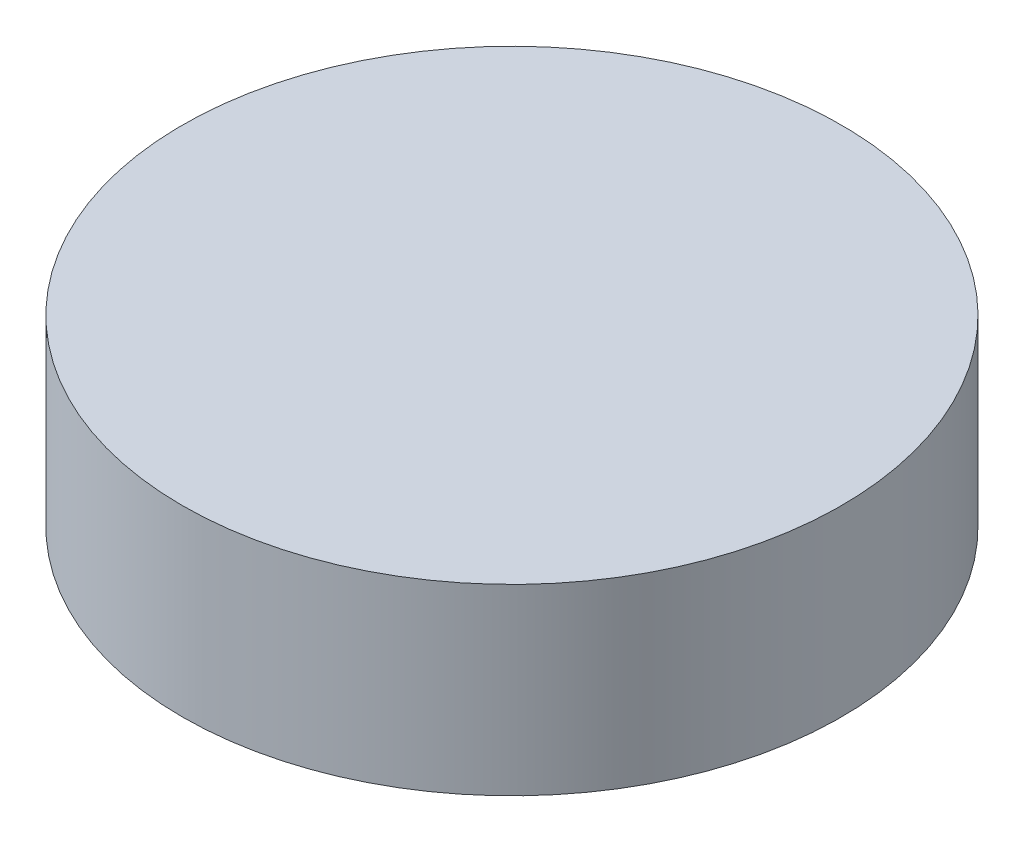
ISO-10303-21;
HEADER;
FILE_DESCRIPTION(('STEP AP214'),'2;1');
FILE_NAME('part.step','',(''),(''),'','','');
FILE_SCHEMA(('AUTOMOTIVE_DESIGN { 1 0 10303 214 1 1 1 1 }'));
ENDSEC;
DATA;
#1=APPLICATION_CONTEXT('core data for automotive mechanical design processes');
#2=APPLICATION_PROTOCOL_DEFINITION('international standard','automotive_design',2000,#1);
#3=PRODUCT_CONTEXT('',#1,'mechanical');
#4=PRODUCT('Part','Part','',(#3));
#5=PRODUCT_RELATED_PRODUCT_CATEGORY('part','',(#4));
#6=PRODUCT_DEFINITION_FORMATION('','',#4);
#7=PRODUCT_DEFINITION_CONTEXT('part definition',#1,'design');
#8=PRODUCT_DEFINITION('design','',#6,#7);
#9=PRODUCT_DEFINITION_SHAPE('','',#8);
#10=(LENGTH_UNIT() NAMED_UNIT(*) SI_UNIT(.MILLI.,.METRE.));
#11=(NAMED_UNIT(*) PLANE_ANGLE_UNIT() SI_UNIT($,.RADIAN.));
#12=(NAMED_UNIT(*) SI_UNIT($,.STERADIAN.) SOLID_ANGLE_UNIT());
#13=UNCERTAINTY_MEASURE_WITH_UNIT(LENGTH_MEASURE(1.E-05),#10,'distance_accuracy_value','');
#14=(GEOMETRIC_REPRESENTATION_CONTEXT(3) GLOBAL_UNCERTAINTY_ASSIGNED_CONTEXT((#13)) GLOBAL_UNIT_ASSIGNED_CONTEXT((#10,
#11,#12)) REPRESENTATION_CONTEXT('',''));
#15=CARTESIAN_POINT('',(0.,0.,0.));
#16=DIRECTION('',(0.,0.,1.));
#17=DIRECTION('',(1.,0.,0.));
#18=AXIS2_PLACEMENT_3D('',#15,#16,#17);
#19=CARTESIAN_POINT('',(4.99965588230111,6.35,4.96193611928675));
#20=DIRECTION('',(0.,-1.,0.));
#21=DIRECTION('',(0.,0.,-1.));
#22=AXIS2_PLACEMENT_3D('',#19,#20,#21);
#23=CYLINDRICAL_SURFACE('',#22,11.43);
#24=CARTESIAN_POINT('',(4.99965588230111,6.35,4.96193611928675));
#25=DIRECTION('',(0.,1.,0.));
#26=DIRECTION('',(0.,0.,1.));
#27=AXIS2_PLACEMENT_3D('',#24,#25,#26);
#28=CIRCLE('',#27,11.43);
#29=CARTESIAN_POINT('',(4.99965588230111,6.35,16.3919361192867));
#30=VERTEX_POINT('',#29);
#31=EDGE_CURVE('E10',#30,#30,#28,.T.);
#32=ORIENTED_EDGE('',*,*,#31,.F.);
#33=EDGE_LOOP('',(#32));
#34=FACE_BOUND('',#33,.T.);
#35=CARTESIAN_POINT('',(4.99965588230111,0.,4.96193611928675));
#36=DIRECTION('',(0.,1.,0.));
#37=DIRECTION('',(0.,0.,1.));
#38=AXIS2_PLACEMENT_3D('',#35,#36,#37);
#39=CIRCLE('',#38,11.43);
#40=CARTESIAN_POINT('',(4.99965588230111,0.,16.3919361192867));
#41=VERTEX_POINT('',#40);
#42=EDGE_CURVE('E36',#41,#41,#39,.T.);
#43=ORIENTED_EDGE('',*,*,#42,.T.);
#44=EDGE_LOOP('',(#43));
#45=FACE_BOUND('',#44,.T.);
#46=ADVANCED_FACE('F33',(#34,#45),#23,.T.);
#47=CARTESIAN_POINT('',(4.99965588230111,6.35,4.96193611928675));
#48=DIRECTION('',(0.,1.,0.));
#49=DIRECTION('',(0.,0.,1.));
#50=AXIS2_PLACEMENT_3D('',#47,#48,#49);
#51=PLANE('',#50);
#52=ORIENTED_EDGE('',*,*,#31,.T.);
#53=EDGE_LOOP('',(#52));
#54=FACE_BOUND('',#53,.T.);
#55=ADVANCED_FACE('F48',(#54),#51,.T.);
#56=CARTESIAN_POINT('',(4.99965588230111,0.,4.96193611928675));
#57=DIRECTION('',(0.,1.,0.));
#58=DIRECTION('',(0.,0.,1.));
#59=AXIS2_PLACEMENT_3D('',#56,#57,#58);
#60=PLANE('',#59);
#61=ORIENTED_EDGE('',*,*,#42,.F.);
#62=EDGE_LOOP('',(#61));
#63=FACE_BOUND('',#62,.T.);
#64=ADVANCED_FACE('F46',(#63),#60,.F.);
#65=CLOSED_SHELL('',(#46,#55,#64));
#66=MANIFOLD_SOLID_BREP('B2',#65);
#67=ADVANCED_BREP_SHAPE_REPRESENTATION('',(#18,#66),#14);
#68=SHAPE_DEFINITION_REPRESENTATION(#9,#67);
ENDSEC;
END-ISO-10303-21;
